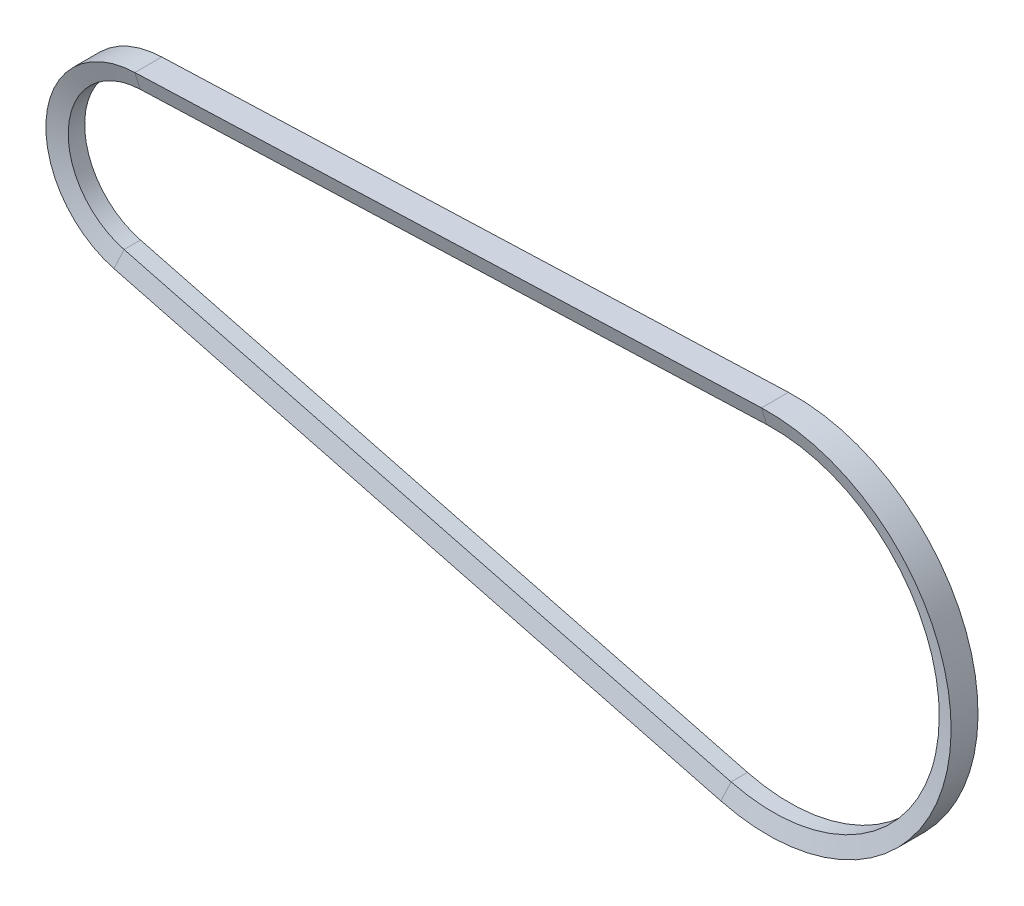
ISO-10303-21;
HEADER;
FILE_DESCRIPTION(('STEP AP214'),'2;1');
FILE_NAME('part.step','',(''),(''),'','','');
FILE_SCHEMA(('AUTOMOTIVE_DESIGN { 1 0 10303 214 1 1 1 1 }'));
ENDSEC;
DATA;
#1=APPLICATION_CONTEXT('core data for automotive mechanical design processes');
#2=APPLICATION_PROTOCOL_DEFINITION('international standard','automotive_design',2000,#1);
#3=PRODUCT_CONTEXT('',#1,'mechanical');
#4=PRODUCT('Part','Part','',(#3));
#5=PRODUCT_RELATED_PRODUCT_CATEGORY('part','',(#4));
#6=PRODUCT_DEFINITION_FORMATION('','',#4);
#7=PRODUCT_DEFINITION_CONTEXT('part definition',#1,'design');
#8=PRODUCT_DEFINITION('design','',#6,#7);
#9=PRODUCT_DEFINITION_SHAPE('','',#8);
#10=(LENGTH_UNIT() NAMED_UNIT(*) SI_UNIT(.MILLI.,.METRE.));
#11=(NAMED_UNIT(*) PLANE_ANGLE_UNIT() SI_UNIT($,.RADIAN.));
#12=(NAMED_UNIT(*) SI_UNIT($,.STERADIAN.) SOLID_ANGLE_UNIT());
#13=UNCERTAINTY_MEASURE_WITH_UNIT(LENGTH_MEASURE(1.E-05),#10,'distance_accuracy_value','');
#14=(GEOMETRIC_REPRESENTATION_CONTEXT(3) GLOBAL_UNCERTAINTY_ASSIGNED_CONTEXT((#13)) GLOBAL_UNIT_ASSIGNED_CONTEXT((#10,
#11,#12)) REPRESENTATION_CONTEXT('',''));
#15=CARTESIAN_POINT('',(0.,0.,0.));
#16=DIRECTION('',(0.,0.,1.));
#17=DIRECTION('',(1.,0.,0.));
#18=AXIS2_PLACEMENT_3D('',#15,#16,#17);
#19=CARTESIAN_POINT('',(-517.290025535438,117.159188529464,7.57196009772206));
#20=DIRECTION('',(0.0365736719913845,-0.999330959450905,0.));
#21=DIRECTION('',(0.999330959450905,0.0365736719913845,0.));
#22=AXIS2_PLACEMENT_3D('',#19,#20,#21);
#23=PLANE('',#22);
#24=DIRECTION('',(0.999330959450905,0.0365736719913845,0.));
#25=VECTOR('',#24,1.);
#26=CARTESIAN_POINT('',(-517.290025535438,117.159188529464,7.57196009772206));
#27=LINE('',#26,#25);
#28=CARTESIAN_POINT('',(-517.290025535438,117.159188529464,7.57196009772206));
#29=VERTEX_POINT('',#28);
#30=CARTESIAN_POINT('',(-4.97401939082906,135.90901048531,7.57196009772206));
#31=VERTEX_POINT('',#30);
#32=EDGE_CURVE('E11',#29,#31,#27,.T.);
#33=ORIENTED_EDGE('',*,*,#32,.F.);
#34=DIRECTION('',(0.,0.,-1.));
#35=VECTOR('',#34,1.);
#36=CARTESIAN_POINT('',(-517.290025535438,117.159188529464,7.57196009772206));
#37=LINE('',#36,#35);
#38=CARTESIAN_POINT('',(-517.290025535438,117.159188529464,-5.86803990227794));
#39=VERTEX_POINT('',#38);
#40=EDGE_CURVE('E42',#29,#39,#37,.T.);
#41=ORIENTED_EDGE('',*,*,#40,.T.);
#42=DIRECTION('',(0.999330959450905,0.0365736719913845,0.));
#43=VECTOR('',#42,1.);
#44=CARTESIAN_POINT('',(-517.290025535438,117.159188529464,-5.86803990227794));
#45=LINE('',#44,#43);
#46=CARTESIAN_POINT('',(-4.97401939082906,135.90901048531,-5.86803990227794));
#47=VERTEX_POINT('',#46);
#48=EDGE_CURVE('E118',#39,#47,#45,.T.);
#49=ORIENTED_EDGE('',*,*,#48,.T.);
#50=DIRECTION('',(0.,0.,-1.));
#51=VECTOR('',#50,1.);
#52=CARTESIAN_POINT('',(-4.97401939082906,135.90901048531,7.57196009772206));
#53=LINE('',#52,#51);
#54=EDGE_CURVE('E121',#31,#47,#53,.T.);
#55=ORIENTED_EDGE('',*,*,#54,.F.);
#56=EDGE_LOOP('',(#33,#41,#49,#55));
#57=FACE_BOUND('',#56,.T.);
#58=ADVANCED_FACE('F39',(#57),#23,.T.);
#59=CARTESIAN_POINT('',(-517.290025535438,131.158437736576,11.8519600977221));
#60=DIRECTION('',(0.0106996532252167,-0.292354968510314,0.956250014278794));
#61=DIRECTION('',(0.,-0.956304755963034,-0.292371704722741));
#62=AXIS2_PLACEMENT_3D('',#59,#60,#61);
#63=PLANE('',#62);
#64=DIRECTION('',(0.999330959450905,0.0365736719913845,0.));
#65=VECTOR('',#64,1.);
#66=CARTESIAN_POINT('',(-517.290025535438,131.158437736576,11.8519600977221));
#67=LINE('',#66,#65);
#68=CARTESIAN_POINT('',(-517.290025535438,131.158437736576,11.8519600977221));
#69=VERTEX_POINT('',#68);
#70=CARTESIAN_POINT('',(-4.97401939082906,149.908259692422,11.8519600977221));
#71=VERTEX_POINT('',#70);
#72=EDGE_CURVE('E47',#69,#71,#67,.T.);
#73=ORIENTED_EDGE('',*,*,#72,.F.);
#74=DIRECTION('',(0.,-0.956304755963034,-0.292371704722741));
#75=VECTOR('',#74,1.);
#76=CARTESIAN_POINT('',(-517.290025535438,131.158437736576,11.8519600977221));
#77=LINE('',#76,#75);
#78=EDGE_CURVE('E191',#69,#29,#77,.T.);
#79=ORIENTED_EDGE('',*,*,#78,.T.);
#80=ORIENTED_EDGE('',*,*,#32,.T.);
#81=DIRECTION('',(0.,-0.956304755963034,-0.292371704722741));
#82=VECTOR('',#81,1.);
#83=CARTESIAN_POINT('',(-4.97401939082906,149.908259692422,11.8519600977221));
#84=LINE('',#83,#82);
#85=EDGE_CURVE('E145',#71,#31,#84,.T.);
#86=ORIENTED_EDGE('',*,*,#85,.F.);
#87=EDGE_LOOP('',(#73,#79,#80,#86));
#88=FACE_BOUND('',#87,.T.);
#89=ADVANCED_FACE('F230',(#88),#63,.T.);
#90=CARTESIAN_POINT('',(-517.290025535438,131.158437736576,-10.1480399022779));
#91=DIRECTION('',(-0.0365736719913845,0.999330959450905,0.));
#92=DIRECTION('',(-0.999330959450905,-0.0365736719913845,0.));
#93=AXIS2_PLACEMENT_3D('',#90,#91,#92);
#94=PLANE('',#93);
#95=DIRECTION('',(0.999330959450905,0.0365736719913845,0.));
#96=VECTOR('',#95,1.);
#97=CARTESIAN_POINT('',(-517.290025535438,131.158437736576,-10.1480399022779));
#98=LINE('',#97,#96);
#99=CARTESIAN_POINT('',(-517.290025535438,131.158437736576,-10.1480399022779));
#100=VERTEX_POINT('',#99);
#101=CARTESIAN_POINT('',(-4.97401939082906,149.908259692422,-10.1480399022779));
#102=VERTEX_POINT('',#101);
#103=EDGE_CURVE('E127',#100,#102,#98,.T.);
#104=ORIENTED_EDGE('',*,*,#103,.F.);
#105=DIRECTION('',(0.,0.,1.));
#106=VECTOR('',#105,1.);
#107=CARTESIAN_POINT('',(-517.290025535438,131.158437736576,-10.1480399022779));
#108=LINE('',#107,#106);
#109=EDGE_CURVE('E172',#100,#69,#108,.T.);
#110=ORIENTED_EDGE('',*,*,#109,.T.);
#111=ORIENTED_EDGE('',*,*,#72,.T.);
#112=DIRECTION('',(0.,0.,1.));
#113=VECTOR('',#112,1.);
#114=CARTESIAN_POINT('',(-4.97401939082906,149.908259692422,-10.1480399022779));
#115=LINE('',#114,#113);
#116=EDGE_CURVE('E149',#102,#71,#115,.T.);
#117=ORIENTED_EDGE('',*,*,#116,.F.);
#118=EDGE_LOOP('',(#104,#110,#111,#117));
#119=FACE_BOUND('',#118,.T.);
#120=ADVANCED_FACE('F234',(#119),#94,.T.);
#121=CARTESIAN_POINT('',(-515.059031543963,56.2000000029592,0.));
#122=DIRECTION('',(0.,0.,-1.));
#123=DIRECTION('',(-1.,0.,0.));
#124=AXIS2_PLACEMENT_3D('',#121,#122,#123);
#125=CYLINDRICAL_SURFACE('',#124,61.);
#126=ORIENTED_EDGE('',*,*,#40,.F.);
#127=CARTESIAN_POINT('',(-515.059031543963,56.2000000029592,7.57196009772206));
#128=DIRECTION('',(0.,0.,-1.));
#129=DIRECTION('',(-0.251228565865827,-0.967927790536567,0.));
#130=AXIS2_PLACEMENT_3D('',#127,#128,#129);
#131=CIRCLE('',#130,61.);
#132=CARTESIAN_POINT('',(-530.383974061772,-2.84359521974667,7.57196009772206));
#133=VERTEX_POINT('',#132);
#134=EDGE_CURVE('E200',#133,#29,#131,.T.);
#135=ORIENTED_EDGE('',*,*,#134,.F.);
#136=DIRECTION('',(0.,0.,-1.));
#137=VECTOR('',#136,1.);
#138=CARTESIAN_POINT('',(-530.383974061779,-2.8435952197714,7.57196009772206));
#139=LINE('',#138,#137);
#140=CARTESIAN_POINT('',(-530.383974061772,-2.84359521974667,-5.86803990227794));
#141=VERTEX_POINT('',#140);
#142=EDGE_CURVE('E175',#133,#141,#139,.T.);
#143=ORIENTED_EDGE('',*,*,#142,.T.);
#144=CARTESIAN_POINT('',(-515.059031543963,56.2000000029592,-5.86803990227794));
#145=DIRECTION('',(0.,0.,-1.));
#146=DIRECTION('',(-0.251228565865827,-0.967927790536567,0.));
#147=AXIS2_PLACEMENT_3D('',#144,#145,#146);
#148=CIRCLE('',#147,61.);
#149=EDGE_CURVE('E169',#141,#39,#148,.T.);
#150=ORIENTED_EDGE('',*,*,#149,.T.);
#151=EDGE_LOOP('',(#126,#135,#143,#150));
#152=FACE_BOUND('',#151,.T.);
#153=ADVANCED_FACE('F207',(#152),#125,.F.);
#154=CARTESIAN_POINT('',(-534.394215190847,-16.2561618812851,11.8519600977221));
#155=CARTESIAN_POINT('',(-645.588379553646,13.4163950483976,11.8519600977221));
#156=CARTESIAN_POINT('',(-632.324283892184,127.734663883129,11.8519600977221));
#157=CARTESIAN_POINT('',(-517.290025535438,131.158437736576,11.8519600977221));
#158=CARTESIAN_POINT('',(-530.383974061779,-2.8435952197714,7.57196009772206));
#159=CARTESIAN_POINT('',(-620.994669702207,20.674683044799,7.57196009772206));
#160=CARTESIAN_POINT('',(-610.840468343436,113.735414676017,7.57196009772206));
#161=CARTESIAN_POINT('',(-517.290025535438,117.159188529464,7.57196009772206));
#162=(BOUNDED_SURFACE() B_SPLINE_SURFACE(1,3,((#154,#155,#156,#157),(#158,#159,#160,#161)),
.UNSPECIFIED.,.F.,.F.,.F.) B_SPLINE_SURFACE_WITH_KNOTS((2,2),(4,4),(0.,1.),(0.,1.),
.UNSPECIFIED.) GEOMETRIC_REPRESENTATION_ITEM() RATIONAL_B_SPLINE_SURFACE(((1.,0.429836808880119,
0.429836808880119,1.),(1.,0.429836808880119,0.429836808880119,1.))) REPRESENTATION_ITEM('') SURFACE());
#163=CARTESIAN_POINT('',(-515.059031543963,56.2000000029592,11.8519600977221));
#164=DIRECTION('',(0.,0.,-1.));
#165=DIRECTION('',(-0.257831219114424,-0.966189972236294,0.));
#166=AXIS2_PLACEMENT_3D('',#163,#164,#165);
#167=CIRCLE('',#166,74.9916310107638);
#168=CARTESIAN_POINT('',(-534.394215190841,-16.2561618812603,11.8519600977221));
#169=VERTEX_POINT('',#168);
#170=EDGE_CURVE('E188',#169,#69,#167,.T.);
#171=DIRECTION('',(0.273944167115678,0.916227798956578,-0.292371704722741));
#172=VECTOR('',#171,1.);
#173=CARTESIAN_POINT('',(-534.394215190848,-16.2561618812851,11.8519600977221));
#174=LINE('',#173,#172);
#175=EDGE_CURVE('E184',#169,#133,#174,.T.);
#176=ORIENTED_EDGE('',*,*,#134,.T.);
#177=ORIENTED_EDGE('',*,*,#78,.F.);
#178=ORIENTED_EDGE('',*,*,#170,.F.);
#179=ORIENTED_EDGE('',*,*,#175,.T.);
#180=EDGE_LOOP('',(#176,#177,#178,#179));
#181=FACE_BOUND('',#180,.T.);
#182=ADVANCED_FACE('F243',(#181),#162,.T.);
#183=CARTESIAN_POINT('',(-515.059031543963,56.2000000029592,0.));
#184=DIRECTION('',(0.,0.,-1.));
#185=DIRECTION('',(-1.,0.,0.));
#186=AXIS2_PLACEMENT_3D('',#183,#184,#185);
#187=CYLINDRICAL_SURFACE('',#186,74.9916310107638);
#188=ORIENTED_EDGE('',*,*,#170,.T.);
#189=ORIENTED_EDGE('',*,*,#109,.F.);
#190=CARTESIAN_POINT('',(-515.059031543963,56.2000000029592,-10.1480399022779));
#191=DIRECTION('',(0.,0.,-1.));
#192=DIRECTION('',(-0.257831219114424,-0.966189972236294,0.));
#193=AXIS2_PLACEMENT_3D('',#190,#191,#192);
#194=CIRCLE('',#193,74.9916310107638);
#195=CARTESIAN_POINT('',(-534.394215190841,-16.2561618812603,-10.1480399022779));
#196=VERTEX_POINT('',#195);
#197=EDGE_CURVE('E168',#196,#100,#194,.T.);
#198=ORIENTED_EDGE('',*,*,#197,.F.);
#199=DIRECTION('',(0.,0.,1.));
#200=VECTOR('',#199,1.);
#201=CARTESIAN_POINT('',(-534.394215190848,-16.2561618812851,-10.1480399022779));
#202=LINE('',#201,#200);
#203=EDGE_CURVE('E161',#196,#169,#202,.T.);
#204=ORIENTED_EDGE('',*,*,#203,.T.);
#205=EDGE_LOOP('',(#188,#189,#198,#204));
#206=FACE_BOUND('',#205,.T.);
#207=ADVANCED_FACE('F215',(#206),#187,.T.);
#208=CARTESIAN_POINT('',(-530.383974061779,-2.8435952197714,-5.86803990227794));
#209=CARTESIAN_POINT('',(-620.994669702207,20.674683044799,-5.86803990227794));
#210=CARTESIAN_POINT('',(-610.840468343436,113.735414676017,-5.86803990227794));
#211=CARTESIAN_POINT('',(-517.290025535438,117.159188529464,-5.86803990227794));
#212=CARTESIAN_POINT('',(-534.394215190847,-16.2561618812851,-10.1480399022779));
#213=CARTESIAN_POINT('',(-645.588379553646,13.4163950483976,-10.1480399022779));
#214=CARTESIAN_POINT('',(-632.324283892184,127.734663883129,-10.1480399022779));
#215=CARTESIAN_POINT('',(-517.290025535438,131.158437736576,-10.1480399022779));
#216=(BOUNDED_SURFACE() B_SPLINE_SURFACE(1,3,((#208,#209,#210,#211),(#212,#213,#214,#215)),
.UNSPECIFIED.,.F.,.F.,.F.) B_SPLINE_SURFACE_WITH_KNOTS((2,2),(4,4),(0.,1.),(0.,1.),
.UNSPECIFIED.) GEOMETRIC_REPRESENTATION_ITEM() RATIONAL_B_SPLINE_SURFACE(((1.,0.429836808880119,
0.429836808880119,1.),(1.,0.429836808880119,0.429836808880119,1.))) REPRESENTATION_ITEM('') SURFACE());
#217=DIRECTION('',(0.,0.956304755963034,-0.29237170472274));
#218=VECTOR('',#217,1.);
#219=CARTESIAN_POINT('',(-517.290025535438,117.159188529464,-5.86803990227794));
#220=LINE('',#219,#218);
#221=EDGE_CURVE('E166',#39,#100,#220,.T.);
#222=DIRECTION('',(-0.273944167115678,-0.916227798956578,-0.29237170472274));
#223=VECTOR('',#222,1.);
#224=CARTESIAN_POINT('',(-530.383974061779,-2.8435952197714,-5.86803990227794));
#225=LINE('',#224,#223);
#226=EDGE_CURVE('E158',#141,#196,#225,.T.);
#227=ORIENTED_EDGE('',*,*,#197,.T.);
#228=ORIENTED_EDGE('',*,*,#221,.F.);
#229=ORIENTED_EDGE('',*,*,#149,.F.);
#230=ORIENTED_EDGE('',*,*,#226,.T.);
#231=EDGE_LOOP('',(#227,#228,#229,#230));
#232=FACE_BOUND('',#231,.T.);
#233=ADVANCED_FACE('F212',(#232),#216,.T.);
#234=CARTESIAN_POINT('',(-34.1670849577481,-131.638179512961,7.57196009772206));
#235=DIRECTION('',(0.251228565865828,0.967927790536567,0.));
#236=DIRECTION('',(-0.967927790536567,0.251228565865828,0.));
#237=AXIS2_PLACEMENT_3D('',#234,#235,#236);
#238=PLANE('',#237);
#239=ORIENTED_EDGE('',*,*,#142,.F.);
#240=DIRECTION('',(-0.967927790536567,0.251228565865828,0.));
#241=VECTOR('',#240,1.);
#242=CARTESIAN_POINT('',(-34.1670849577481,-131.638179512961,7.57196009772206));
#243=LINE('',#242,#241);
#244=CARTESIAN_POINT('',(-34.1670849577544,-131.638179512986,7.57196009772206));
#245=VERTEX_POINT('',#244);
#246=EDGE_CURVE('E83',#245,#133,#243,.T.);
#247=ORIENTED_EDGE('',*,*,#246,.F.);
#248=DIRECTION('',(0.,0.,-1.));
#249=VECTOR('',#248,1.);
#250=CARTESIAN_POINT('',(-34.1670849577481,-131.638179512961,7.57196009772206));
#251=LINE('',#250,#249);
#252=CARTESIAN_POINT('',(-34.1670849577544,-131.638179512986,-5.86803990227794));
#253=VERTEX_POINT('',#252);
#254=EDGE_CURVE('E165',#245,#253,#251,.T.);
#255=ORIENTED_EDGE('',*,*,#254,.T.);
#256=DIRECTION('',(-0.967927790536567,0.251228565865828,0.));
#257=VECTOR('',#256,1.);
#258=CARTESIAN_POINT('',(-34.1670849577481,-131.638179512961,-5.86803990227794));
#259=LINE('',#258,#257);
#260=EDGE_CURVE('E163',#253,#141,#259,.T.);
#261=ORIENTED_EDGE('',*,*,#260,.T.);
#262=EDGE_LOOP('',(#239,#247,#255,#261));
#263=FACE_BOUND('',#262,.T.);
#264=ADVANCED_FACE('F225',(#263),#238,.T.);
#265=CARTESIAN_POINT('',(-38.177326086817,-145.050746174475,11.8519600977221));
#266=DIRECTION('',(0.0734970919973824,0.283167949563038,0.956250014278794));
#267=DIRECTION('',(0.,-0.958843271694982,0.283935873614558));
#268=AXIS2_PLACEMENT_3D('',#265,#266,#267);
#269=PLANE('',#268);
#270=ORIENTED_EDGE('',*,*,#246,.T.);
#271=ORIENTED_EDGE('',*,*,#175,.F.);
#272=DIRECTION('',(-0.967927790536567,0.251228565865828,0.));
#273=VECTOR('',#272,1.);
#274=CARTESIAN_POINT('',(-38.177326086817,-145.050746174475,11.8519600977221));
#275=LINE('',#274,#273);
#276=CARTESIAN_POINT('',(-38.1773260868233,-145.050746174499,11.8519600977221));
#277=VERTEX_POINT('',#276);
#278=EDGE_CURVE('E93',#277,#169,#275,.T.);
#279=ORIENTED_EDGE('',*,*,#278,.F.);
#280=DIRECTION('',(0.273944167115677,0.916227798956578,-0.292371704722741));
#281=VECTOR('',#280,1.);
#282=CARTESIAN_POINT('',(-38.1773260868169,-145.050746174475,11.8519600977221));
#283=LINE('',#282,#281);
#284=EDGE_CURVE('E181',#277,#245,#283,.T.);
#285=ORIENTED_EDGE('',*,*,#284,.T.);
#286=EDGE_LOOP('',(#270,#271,#279,#285));
#287=FACE_BOUND('',#286,.T.);
#288=ADVANCED_FACE('F218',(#287),#269,.T.);
#289=CARTESIAN_POINT('',(-38.177326086817,-145.050746174475,-10.1480399022779));
#290=DIRECTION('',(-0.251228565865828,-0.967927790536567,0.));
#291=DIRECTION('',(0.967927790536567,-0.251228565865828,0.));
#292=AXIS2_PLACEMENT_3D('',#289,#290,#291);
#293=PLANE('',#292);
#294=ORIENTED_EDGE('',*,*,#278,.T.);
#295=ORIENTED_EDGE('',*,*,#203,.F.);
#296=DIRECTION('',(-0.967927790536567,0.251228565865828,0.));
#297=VECTOR('',#296,1.);
#298=CARTESIAN_POINT('',(-38.177326086817,-145.050746174475,-10.1480399022779));
#299=LINE('',#298,#297);
#300=CARTESIAN_POINT('',(-38.1773260868233,-145.050746174499,-10.1480399022779));
#301=VERTEX_POINT('',#300);
#302=EDGE_CURVE('E101',#301,#196,#299,.T.);
#303=ORIENTED_EDGE('',*,*,#302,.F.);
#304=DIRECTION('',(0.,0.,1.));
#305=VECTOR('',#304,1.);
#306=CARTESIAN_POINT('',(-38.1773260868169,-145.050746174475,-10.1480399022779));
#307=LINE('',#306,#305);
#308=EDGE_CURVE('E156',#301,#277,#307,.T.);
#309=ORIENTED_EDGE('',*,*,#308,.T.);
#310=EDGE_LOOP('',(#294,#295,#303,#309));
#311=FACE_BOUND('',#310,.T.);
#312=ADVANCED_FACE('F216',(#311),#293,.T.);
#313=CARTESIAN_POINT('',(-34.1670849577481,-131.638179512961,-5.86803990227794));
#314=DIRECTION('',(0.0734970919973821,0.283167949563037,-0.956250014278794));
#315=DIRECTION('',(0.,0.958843271694983,0.283935873614557));
#316=AXIS2_PLACEMENT_3D('',#313,#314,#315);
#317=PLANE('',#316);
#318=ORIENTED_EDGE('',*,*,#302,.T.);
#319=ORIENTED_EDGE('',*,*,#226,.F.);
#320=ORIENTED_EDGE('',*,*,#260,.F.);
#321=DIRECTION('',(-0.273944167115677,-0.916227798956578,-0.29237170472274));
#322=VECTOR('',#321,1.);
#323=CARTESIAN_POINT('',(-34.1670849577481,-131.638179512961,-5.86803990227794));
#324=LINE('',#323,#322);
#325=EDGE_CURVE('E137',#253,#301,#324,.T.);
#326=ORIENTED_EDGE('',*,*,#325,.T.);
#327=EDGE_LOOP('',(#318,#319,#320,#326));
#328=FACE_BOUND('',#327,.T.);
#329=ADVANCED_FACE('F210',(#328),#317,.T.);
#330=CARTESIAN_POINT('',(-7.7715611723761E-13,-1.28785870856518E-11,0.));
#331=DIRECTION('',(0.,0.,-1.));
#332=DIRECTION('',(-1.,0.,0.));
#333=AXIS2_PLACEMENT_3D('',#330,#331,#332);
#334=CYLINDRICAL_SURFACE('',#333,136.);
#335=ORIENTED_EDGE('',*,*,#254,.F.);
#336=CARTESIAN_POINT('',(-7.7715611723761E-13,-1.28785870856518E-11,7.57196009772206));
#337=DIRECTION('',(0.,0.,-1.));
#338=DIRECTION('',(-0.0365736719913844,0.999330959450905,0.));
#339=AXIS2_PLACEMENT_3D('',#336,#337,#338);
#340=CIRCLE('',#339,136.);
#341=EDGE_CURVE('E144',#31,#245,#340,.T.);
#342=ORIENTED_EDGE('',*,*,#341,.F.);
#343=ORIENTED_EDGE('',*,*,#54,.T.);
#344=CARTESIAN_POINT('',(-7.7715611723761E-13,-1.28785870856518E-11,-5.86803990227794));
#345=DIRECTION('',(0.,0.,-1.));
#346=DIRECTION('',(-0.0365736719913844,0.999330959450905,0.));
#347=AXIS2_PLACEMENT_3D('',#344,#345,#346);
#348=CIRCLE('',#347,136.);
#349=EDGE_CURVE('E133',#47,#253,#348,.T.);
#350=ORIENTED_EDGE('',*,*,#349,.T.);
#351=EDGE_LOOP('',(#335,#342,#343,#350));
#352=FACE_BOUND('',#351,.T.);
#353=ADVANCED_FACE('F142',(#352),#334,.F.);
#354=CARTESIAN_POINT('',(-4.97401939082906,149.908259692422,11.8519600977221));
#355=CARTESIAN_POINT('',(93.3111534241724,153.169403250594,11.8519600977221));
#356=CARTESIAN_POINT('',(160.049861382915,80.9436799064877,11.8519600977221));
#357=CARTESIAN_POINT('',(149.049365780715,-16.7783715920747,11.8519600977221));
#358=CARTESIAN_POINT('',(138.048870178515,-114.500423090637,11.8519600977221));
#359=CARTESIAN_POINT('',(56.9230885531309,-170.081155437848,11.8519600977221));
#360=CARTESIAN_POINT('',(-38.1773260868222,-145.0507461745,11.8519600977221));
#361=CARTESIAN_POINT('',(-4.97401939082906,135.90901048531,7.57196009772206));
#362=CARTESIAN_POINT('',(84.1327490425578,139.170154043482,7.57196009772206));
#363=CARTESIAN_POINT('',(144.869437421651,73.8884113990857,7.57196009772206));
#364=CARTESIAN_POINT('',(135.19756370365,-14.7519072867769,7.57196009772206));
#365=CARTESIAN_POINT('',(125.525689985649,-103.392225972639,7.57196009772206));
#366=CARTESIAN_POINT('',(52.1395751891235,-154.039332435096,7.57196009772206));
#367=CARTESIAN_POINT('',(-34.1670849577533,-131.638179512986,7.57196009772206));
#368=(BOUNDED_SURFACE() B_SPLINE_SURFACE(1,3,((#354,#355,#356,#357,#358,#359,#360),(#361,#362,
#363,#364,#365,#366,#367)),.UNSPECIFIED.,.F.,.F.,.F.) B_SPLINE_SURFACE_WITH_KNOTS((2,2),(4,3,4),
(0.,1.),(0.,0.5,1.),
.UNSPECIFIED.) GEOMETRIC_REPRESENTATION_ITEM() RATIONAL_B_SPLINE_SURFACE(((1.,0.769285620906137,
0.769285620906137,1.,0.769285620906137,0.769285620906137,1.),(1.,0.769285620906137,
0.769285620906137,1.,0.769285620906137,0.769285620906137,1.))) REPRESENTATION_ITEM('') SURFACE());
#369=CARTESIAN_POINT('',(-7.7715611723761E-13,-1.28785870856518E-11,11.8519600977221));
#370=DIRECTION('',(0.,0.,-1.));
#371=DIRECTION('',(-0.0331621727197576,0.999449983891393,0.));
#372=AXIS2_PLACEMENT_3D('',#369,#370,#371);
#373=CIRCLE('',#372,149.990757024941);
#374=EDGE_CURVE('E178',#71,#277,#373,.T.);
#375=ORIENTED_EDGE('',*,*,#341,.T.);
#376=ORIENTED_EDGE('',*,*,#284,.F.);
#377=ORIENTED_EDGE('',*,*,#374,.F.);
#378=ORIENTED_EDGE('',*,*,#85,.T.);
#379=EDGE_LOOP('',(#375,#376,#377,#378));
#380=FACE_BOUND('',#379,.T.);
#381=ADVANCED_FACE('F248',(#380),#368,.T.);
#382=CARTESIAN_POINT('',(-7.7715611723761E-13,-1.28785870856518E-11,0.));
#383=DIRECTION('',(0.,0.,-1.));
#384=DIRECTION('',(-1.,0.,0.));
#385=AXIS2_PLACEMENT_3D('',#382,#383,#384);
#386=CYLINDRICAL_SURFACE('',#385,149.990757024941);
#387=ORIENTED_EDGE('',*,*,#374,.T.);
#388=ORIENTED_EDGE('',*,*,#308,.F.);
#389=CARTESIAN_POINT('',(-7.7715611723761E-13,-1.28785870856518E-11,-10.1480399022779));
#390=DIRECTION('',(0.,0.,-1.));
#391=DIRECTION('',(-0.0331621727197576,0.999449983891393,0.));
#392=AXIS2_PLACEMENT_3D('',#389,#390,#391);
#393=CIRCLE('',#392,149.990757024941);
#394=EDGE_CURVE('E155',#102,#301,#393,.T.);
#395=ORIENTED_EDGE('',*,*,#394,.F.);
#396=ORIENTED_EDGE('',*,*,#116,.T.);
#397=EDGE_LOOP('',(#387,#388,#395,#396));
#398=FACE_BOUND('',#397,.T.);
#399=ADVANCED_FACE('F262',(#398),#386,.T.);
#400=CARTESIAN_POINT('',(-4.97401939082906,135.90901048531,-5.86803990227794));
#401=CARTESIAN_POINT('',(84.1327490425578,139.170154043482,-5.86803990227794));
#402=CARTESIAN_POINT('',(144.869437421651,73.8884113990857,-5.86803990227794));
#403=CARTESIAN_POINT('',(135.19756370365,-14.7519072867769,-5.86803990227794));
#404=CARTESIAN_POINT('',(125.525689985649,-103.392225972639,-5.86803990227794));
#405=CARTESIAN_POINT('',(52.1395751891235,-154.039332435096,-5.86803990227794));
#406=CARTESIAN_POINT('',(-34.1670849577533,-131.638179512986,-5.86803990227794));
#407=CARTESIAN_POINT('',(-4.97401939082906,149.908259692422,-10.1480399022779));
#408=CARTESIAN_POINT('',(93.3111534241724,153.169403250594,-10.1480399022779));
#409=CARTESIAN_POINT('',(160.049861382915,80.9436799064877,-10.1480399022779));
#410=CARTESIAN_POINT('',(149.049365780715,-16.7783715920747,-10.1480399022779));
#411=CARTESIAN_POINT('',(138.048870178515,-114.500423090637,-10.1480399022779));
#412=CARTESIAN_POINT('',(56.9230885531309,-170.081155437848,-10.1480399022779));
#413=CARTESIAN_POINT('',(-38.1773260868222,-145.0507461745,-10.1480399022779));
#414=(BOUNDED_SURFACE() B_SPLINE_SURFACE(1,3,((#400,#401,#402,#403,#404,#405,#406),(#407,#408,
#409,#410,#411,#412,#413)),.UNSPECIFIED.,.F.,.F.,.F.) B_SPLINE_SURFACE_WITH_KNOTS((2,2),(4,3,4),
(0.,1.),(0.,0.5,1.),
.UNSPECIFIED.) GEOMETRIC_REPRESENTATION_ITEM() RATIONAL_B_SPLINE_SURFACE(((1.,0.769285620906137,
0.769285620906137,1.,0.769285620906137,0.769285620906137,1.),(1.,0.769285620906137,
0.769285620906137,1.,0.769285620906137,0.769285620906137,1.))) REPRESENTATION_ITEM('') SURFACE());
#415=DIRECTION('',(0.,0.956304755963034,-0.29237170472274));
#416=VECTOR('',#415,1.);
#417=CARTESIAN_POINT('',(-4.97401939082906,135.90901048531,-5.86803990227794));
#418=LINE('',#417,#416);
#419=EDGE_CURVE('E136',#47,#102,#418,.T.);
#420=ORIENTED_EDGE('',*,*,#394,.T.);
#421=ORIENTED_EDGE('',*,*,#325,.F.);
#422=ORIENTED_EDGE('',*,*,#349,.F.);
#423=ORIENTED_EDGE('',*,*,#419,.T.);
#424=EDGE_LOOP('',(#420,#421,#422,#423));
#425=FACE_BOUND('',#424,.T.);
#426=ADVANCED_FACE('F135',(#425),#414,.T.);
#427=CARTESIAN_POINT('',(-517.290025535438,117.159188529464,-5.86803990227794));
#428=DIRECTION('',(0.0106996532252167,-0.292354968510313,-0.956250014278794));
#429=DIRECTION('',(0.,0.956304755963034,-0.29237170472274));
#430=AXIS2_PLACEMENT_3D('',#427,#428,#429);
#431=PLANE('',#430);
#432=ORIENTED_EDGE('',*,*,#221,.T.);
#433=ORIENTED_EDGE('',*,*,#103,.T.);
#434=ORIENTED_EDGE('',*,*,#419,.F.);
#435=ORIENTED_EDGE('',*,*,#48,.F.);
#436=EDGE_LOOP('',(#432,#433,#434,#435));
#437=FACE_BOUND('',#436,.T.);
#438=ADVANCED_FACE('F147',(#437),#431,.T.);
#439=CLOSED_SHELL('',(#58,#89,#120,#153,#182,#207,#233,#264,#288,#312,#329,#353,#381,#399,#426,#438));
#440=MANIFOLD_SOLID_BREP('B2',#439);
#441=ADVANCED_BREP_SHAPE_REPRESENTATION('',(#18,#440),#14);
#442=SHAPE_DEFINITION_REPRESENTATION(#9,#441);
ENDSEC;
END-ISO-10303-21;
